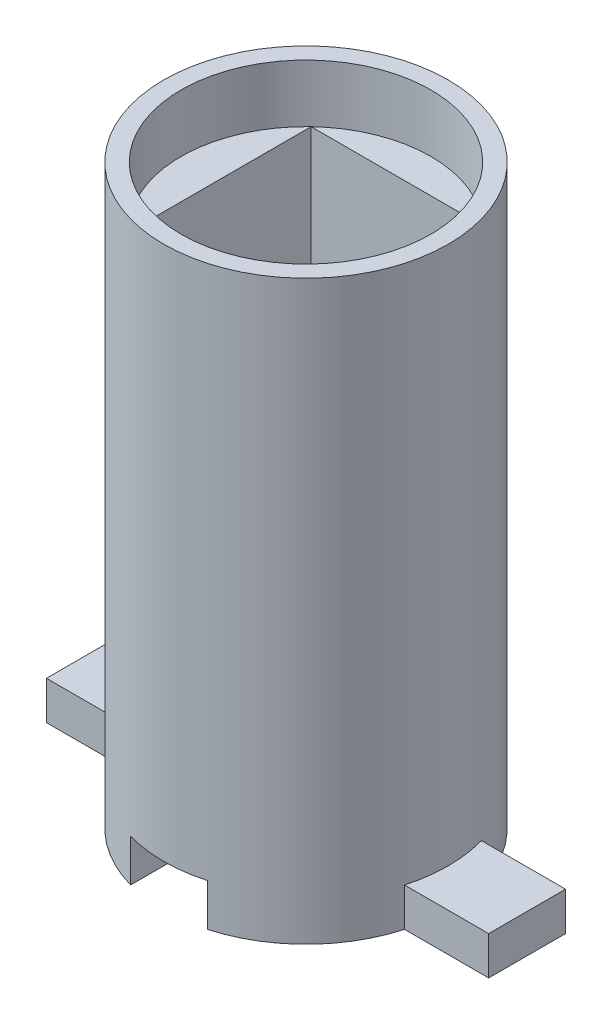
ISO-10303-21;
HEADER;
FILE_DESCRIPTION(('STEP AP214'),'2;1');
FILE_NAME('part.step','',(''),(''),'','','');
FILE_SCHEMA(('AUTOMOTIVE_DESIGN { 1 0 10303 214 1 1 1 1 }'));
ENDSEC;
DATA;
#1=APPLICATION_CONTEXT('core data for automotive mechanical design processes');
#2=APPLICATION_PROTOCOL_DEFINITION('international standard','automotive_design',2000,#1);
#3=PRODUCT_CONTEXT('',#1,'mechanical');
#4=PRODUCT('Part','Part','',(#3));
#5=PRODUCT_RELATED_PRODUCT_CATEGORY('part','',(#4));
#6=PRODUCT_DEFINITION_FORMATION('','',#4);
#7=PRODUCT_DEFINITION_CONTEXT('part definition',#1,'design');
#8=PRODUCT_DEFINITION('design','',#6,#7);
#9=PRODUCT_DEFINITION_SHAPE('','',#8);
#10=(LENGTH_UNIT() NAMED_UNIT(*) SI_UNIT(.MILLI.,.METRE.));
#11=(NAMED_UNIT(*) PLANE_ANGLE_UNIT() SI_UNIT($,.RADIAN.));
#12=(NAMED_UNIT(*) SI_UNIT($,.STERADIAN.) SOLID_ANGLE_UNIT());
#13=UNCERTAINTY_MEASURE_WITH_UNIT(LENGTH_MEASURE(1.E-05),#10,'distance_accuracy_value','');
#14=(GEOMETRIC_REPRESENTATION_CONTEXT(3) GLOBAL_UNCERTAINTY_ASSIGNED_CONTEXT((#13)) GLOBAL_UNIT_ASSIGNED_CONTEXT((#10,
#11,#12)) REPRESENTATION_CONTEXT('',''));
#15=CARTESIAN_POINT('',(0.,0.,0.));
#16=DIRECTION('',(0.,0.,1.));
#17=DIRECTION('',(1.,0.,0.));
#18=AXIS2_PLACEMENT_3D('',#15,#16,#17);
#19=CARTESIAN_POINT('',(21.5,36.,21.5));
#20=DIRECTION('',(1.,0.,0.));
#21=DIRECTION('',(0.,0.,-1.));
#22=AXIS2_PLACEMENT_3D('',#19,#20,#21);
#23=PLANE('',#22);
#24=DIRECTION('',(0.,0.,1.));
#25=VECTOR('',#24,1.);
#26=CARTESIAN_POINT('',(21.5,0.,21.5));
#27=LINE('',#26,#25);
#28=CARTESIAN_POINT('',(21.5,0.,-16.5));
#29=VERTEX_POINT('',#28);
#30=CARTESIAN_POINT('',(21.5,0.,16.5));
#31=VERTEX_POINT('',#30);
#32=EDGE_CURVE('E384',#29,#31,#27,.T.);
#33=ORIENTED_EDGE('',*,*,#32,.T.);
#34=DIRECTION('',(0.,1.,0.));
#35=VECTOR('',#34,1.);
#36=CARTESIAN_POINT('',(21.5,36.,16.5));
#37=LINE('',#36,#35);
#38=CARTESIAN_POINT('',(21.5,31.,16.5));
#39=VERTEX_POINT('',#38);
#40=EDGE_CURVE('E423',#31,#39,#37,.T.);
#41=ORIENTED_EDGE('',*,*,#40,.T.);
#42=DIRECTION('',(0.,0.,1.));
#43=VECTOR('',#42,1.);
#44=CARTESIAN_POINT('',(21.5,31.,21.5));
#45=LINE('',#44,#43);
#46=CARTESIAN_POINT('',(21.5,31.,-16.5));
#47=VERTEX_POINT('',#46);
#48=EDGE_CURVE('E361',#47,#39,#45,.T.);
#49=ORIENTED_EDGE('',*,*,#48,.F.);
#50=DIRECTION('',(0.,-1.,0.));
#51=VECTOR('',#50,1.);
#52=CARTESIAN_POINT('',(21.5,0.,-16.5));
#53=LINE('',#52,#51);
#54=EDGE_CURVE('E420',#47,#29,#53,.T.);
#55=ORIENTED_EDGE('',*,*,#54,.T.);
#56=EDGE_LOOP('',(#33,#41,#49,#55));
#57=FACE_BOUND('',#56,.T.);
#58=ADVANCED_FACE('F41',(#57),#23,.F.);
#59=CARTESIAN_POINT('',(-21.5,36.,-21.5));
#60=DIRECTION('',(0.,0.,-1.));
#61=DIRECTION('',(-1.,0.,0.));
#62=AXIS2_PLACEMENT_3D('',#59,#60,#61);
#63=PLANE('',#62);
#64=DIRECTION('',(1.,0.,0.));
#65=VECTOR('',#64,1.);
#66=CARTESIAN_POINT('',(-21.5,31.,-21.5));
#67=LINE('',#66,#65);
#68=CARTESIAN_POINT('',(-16.4999999999999,31.,-21.5));
#69=VERTEX_POINT('',#68);
#70=CARTESIAN_POINT('',(16.5,31.,-21.5));
#71=VERTEX_POINT('',#70);
#72=EDGE_CURVE('E349',#69,#71,#67,.T.);
#73=ORIENTED_EDGE('',*,*,#72,.F.);
#74=DIRECTION('',(0.,-1.,0.));
#75=VECTOR('',#74,1.);
#76=CARTESIAN_POINT('',(-16.4999999999999,0.,-21.5));
#77=LINE('',#76,#75);
#78=CARTESIAN_POINT('',(-16.4999999999999,0.,-21.5));
#79=VERTEX_POINT('',#78);
#80=EDGE_CURVE('E438',#69,#79,#77,.T.);
#81=ORIENTED_EDGE('',*,*,#80,.T.);
#82=DIRECTION('',(1.,0.,0.));
#83=VECTOR('',#82,1.);
#84=CARTESIAN_POINT('',(-21.5,0.,-21.5));
#85=LINE('',#84,#83);
#86=CARTESIAN_POINT('',(16.5,0.,-21.5));
#87=VERTEX_POINT('',#86);
#88=EDGE_CURVE('E400',#79,#87,#85,.T.);
#89=ORIENTED_EDGE('',*,*,#88,.T.);
#90=DIRECTION('',(0.,1.,0.));
#91=VECTOR('',#90,1.);
#92=CARTESIAN_POINT('',(16.5,36.,-21.5));
#93=LINE('',#92,#91);
#94=EDGE_CURVE('E434',#87,#71,#93,.T.);
#95=ORIENTED_EDGE('',*,*,#94,.T.);
#96=EDGE_LOOP('',(#73,#81,#89,#95));
#97=FACE_BOUND('',#96,.T.);
#98=ADVANCED_FACE('F504',(#97),#63,.F.);
#99=CARTESIAN_POINT('',(-21.5,36.,21.5));
#100=DIRECTION('',(-1.,0.,0.));
#101=DIRECTION('',(0.,0.,1.));
#102=AXIS2_PLACEMENT_3D('',#99,#100,#101);
#103=PLANE('',#102);
#104=DIRECTION('',(0.,0.,-1.));
#105=VECTOR('',#104,1.);
#106=CARTESIAN_POINT('',(-21.5,0.,21.5));
#107=LINE('',#106,#105);
#108=CARTESIAN_POINT('',(-21.5,0.,16.5));
#109=VERTEX_POINT('',#108);
#110=CARTESIAN_POINT('',(-21.5,0.,-16.5));
#111=VERTEX_POINT('',#110);
#112=EDGE_CURVE('E397',#109,#111,#107,.T.);
#113=ORIENTED_EDGE('',*,*,#112,.T.);
#114=DIRECTION('',(0.,1.,0.));
#115=VECTOR('',#114,1.);
#116=CARTESIAN_POINT('',(-21.5,36.,-16.5));
#117=LINE('',#116,#115);
#118=CARTESIAN_POINT('',(-21.5,31.,-16.5));
#119=VERTEX_POINT('',#118);
#120=EDGE_CURVE('E427',#111,#119,#117,.T.);
#121=ORIENTED_EDGE('',*,*,#120,.T.);
#122=DIRECTION('',(0.,0.,-1.));
#123=VECTOR('',#122,1.);
#124=CARTESIAN_POINT('',(-21.5,31.,21.5));
#125=LINE('',#124,#123);
#126=CARTESIAN_POINT('',(-21.5,31.,16.5));
#127=VERTEX_POINT('',#126);
#128=EDGE_CURVE('E373',#127,#119,#125,.T.);
#129=ORIENTED_EDGE('',*,*,#128,.F.);
#130=DIRECTION('',(0.,-1.,0.));
#131=VECTOR('',#130,1.);
#132=CARTESIAN_POINT('',(-21.5,0.,16.5));
#133=LINE('',#132,#131);
#134=EDGE_CURVE('E431',#127,#109,#133,.T.);
#135=ORIENTED_EDGE('',*,*,#134,.T.);
#136=EDGE_LOOP('',(#113,#121,#129,#135));
#137=FACE_BOUND('',#136,.T.);
#138=ADVANCED_FACE('F510',(#137),#103,.F.);
#139=CARTESIAN_POINT('',(-21.5,36.,21.5));
#140=DIRECTION('',(0.,0.,1.));
#141=DIRECTION('',(1.,0.,0.));
#142=AXIS2_PLACEMENT_3D('',#139,#140,#141);
#143=PLANE('',#142);
#144=DIRECTION('',(-1.,0.,0.));
#145=VECTOR('',#144,1.);
#146=CARTESIAN_POINT('',(-21.5,0.,21.5));
#147=LINE('',#146,#145);
#148=CARTESIAN_POINT('',(16.4999999999999,0.,21.5));
#149=VERTEX_POINT('',#148);
#150=CARTESIAN_POINT('',(10.,0.,21.5));
#151=VERTEX_POINT('',#150);
#152=EDGE_CURVE('E393',#149,#151,#147,.T.);
#153=ORIENTED_EDGE('',*,*,#152,.T.);
#154=DIRECTION('',(0.,-1.,0.));
#155=VECTOR('',#154,1.);
#156=CARTESIAN_POINT('',(10.,11.,21.5));
#157=LINE('',#156,#155);
#158=CARTESIAN_POINT('',(10.,11.,21.5));
#159=VERTEX_POINT('',#158);
#160=EDGE_CURVE('E268',#159,#151,#157,.T.);
#161=ORIENTED_EDGE('',*,*,#160,.F.);
#162=DIRECTION('',(1.,0.,0.));
#163=VECTOR('',#162,1.);
#164=CARTESIAN_POINT('',(-10.,11.,21.5));
#165=LINE('',#164,#163);
#166=CARTESIAN_POINT('',(-10.,11.,21.5));
#167=VERTEX_POINT('',#166);
#168=EDGE_CURVE('E261',#167,#159,#165,.T.);
#169=ORIENTED_EDGE('',*,*,#168,.F.);
#170=DIRECTION('',(0.,-1.,0.));
#171=VECTOR('',#170,1.);
#172=CARTESIAN_POINT('',(-10.,11.,21.5));
#173=LINE('',#172,#171);
#174=CARTESIAN_POINT('',(-10.,0.,21.5));
#175=VERTEX_POINT('',#174);
#176=EDGE_CURVE('E265',#167,#175,#173,.T.);
#177=ORIENTED_EDGE('',*,*,#176,.T.);
#178=CARTESIAN_POINT('',(-16.5,0.,21.5));
#179=VERTEX_POINT('',#178);
#180=EDGE_CURVE('E392',#175,#179,#147,.T.);
#181=ORIENTED_EDGE('',*,*,#180,.T.);
#182=DIRECTION('',(0.,1.,0.));
#183=VECTOR('',#182,1.);
#184=CARTESIAN_POINT('',(-16.5,36.,21.5));
#185=LINE('',#184,#183);
#186=CARTESIAN_POINT('',(-16.5,31.,21.5));
#187=VERTEX_POINT('',#186);
#188=EDGE_CURVE('E409',#179,#187,#185,.T.);
#189=ORIENTED_EDGE('',*,*,#188,.T.);
#190=DIRECTION('',(-1.,0.,0.));
#191=VECTOR('',#190,1.);
#192=CARTESIAN_POINT('',(-21.5,31.,21.5));
#193=LINE('',#192,#191);
#194=CARTESIAN_POINT('',(16.4999999999999,31.,21.5));
#195=VERTEX_POINT('',#194);
#196=EDGE_CURVE('E370',#195,#187,#193,.T.);
#197=ORIENTED_EDGE('',*,*,#196,.F.);
#198=DIRECTION('',(0.,-1.,0.));
#199=VECTOR('',#198,1.);
#200=CARTESIAN_POINT('',(16.4999999999999,0.,21.5));
#201=LINE('',#200,#199);
#202=EDGE_CURVE('E417',#195,#149,#201,.T.);
#203=ORIENTED_EDGE('',*,*,#202,.T.);
#204=EDGE_LOOP('',(#153,#161,#169,#177,#181,#189,#197,#203));
#205=FACE_BOUND('',#204,.T.);
#206=ADVANCED_FACE('F515',(#205),#143,.F.);
#207=CARTESIAN_POINT('',(16.4999999999999,36.,21.5));
#208=DIRECTION('',(-0.707106781186543,0.,-0.707106781186551));
#209=DIRECTION('',(0.,1.,0.));
#210=AXIS2_PLACEMENT_3D('',#207,#208,#209);
#211=PLANE('',#210);
#212=DIRECTION('',(0.707106781186551,0.,-0.707106781186544));
#213=VECTOR('',#212,1.);
#214=CARTESIAN_POINT('',(16.4999999999999,31.,21.5));
#215=LINE('',#214,#213);
#216=EDGE_CURVE('E367',#39,#195,#215,.F.);
#217=ORIENTED_EDGE('',*,*,#216,.F.);
#218=ORIENTED_EDGE('',*,*,#40,.F.);
#219=DIRECTION('',(-0.707106781186551,0.,0.707106781186544));
#220=VECTOR('',#219,1.);
#221=CARTESIAN_POINT('',(18.9999999999999,0.,19.0000000000001));
#222=LINE('',#221,#220);
#223=EDGE_CURVE('E441',#149,#31,#222,.F.);
#224=ORIENTED_EDGE('',*,*,#223,.F.);
#225=ORIENTED_EDGE('',*,*,#202,.F.);
#226=EDGE_LOOP('',(#217,#218,#224,#225));
#227=FACE_BOUND('',#226,.T.);
#228=ADVANCED_FACE('F529',(#227),#211,.T.);
#229=CARTESIAN_POINT('',(-21.5,36.,16.5));
#230=DIRECTION('',(0.707106781186551,0.,-0.707106781186544));
#231=DIRECTION('',(0.,1.,0.));
#232=AXIS2_PLACEMENT_3D('',#229,#230,#231);
#233=PLANE('',#232);
#234=DIRECTION('',(0.707106781186544,0.,0.707106781186551));
#235=VECTOR('',#234,1.);
#236=CARTESIAN_POINT('',(-21.5,31.,16.5));
#237=LINE('',#236,#235);
#238=EDGE_CURVE('E376',#187,#127,#237,.F.);
#239=ORIENTED_EDGE('',*,*,#238,.F.);
#240=ORIENTED_EDGE('',*,*,#188,.F.);
#241=DIRECTION('',(-0.707106781186544,0.,-0.707106781186551));
#242=VECTOR('',#241,1.);
#243=CARTESIAN_POINT('',(-19.0000000000001,0.,18.9999999999999));
#244=LINE('',#243,#242);
#245=EDGE_CURVE('E445',#109,#179,#244,.F.);
#246=ORIENTED_EDGE('',*,*,#245,.F.);
#247=ORIENTED_EDGE('',*,*,#134,.F.);
#248=EDGE_LOOP('',(#239,#240,#246,#247));
#249=FACE_BOUND('',#248,.T.);
#250=ADVANCED_FACE('F535',(#249),#233,.T.);
#251=CARTESIAN_POINT('',(-16.4999999999999,36.,-21.5));
#252=DIRECTION('',(0.707106781186543,0.,0.707106781186551));
#253=DIRECTION('',(0.,1.,0.));
#254=AXIS2_PLACEMENT_3D('',#251,#252,#253);
#255=PLANE('',#254);
#256=DIRECTION('',(-0.707106781186551,0.,0.707106781186544));
#257=VECTOR('',#256,1.);
#258=CARTESIAN_POINT('',(-16.4999999999999,31.,-21.5));
#259=LINE('',#258,#257);
#260=EDGE_CURVE('E364',#119,#69,#259,.F.);
#261=ORIENTED_EDGE('',*,*,#260,.F.);
#262=ORIENTED_EDGE('',*,*,#120,.F.);
#263=DIRECTION('',(0.707106781186551,0.,-0.707106781186544));
#264=VECTOR('',#263,1.);
#265=CARTESIAN_POINT('',(-18.9999999999999,0.,-19.0000000000001));
#266=LINE('',#265,#264);
#267=EDGE_CURVE('E449',#79,#111,#266,.F.);
#268=ORIENTED_EDGE('',*,*,#267,.F.);
#269=ORIENTED_EDGE('',*,*,#80,.F.);
#270=EDGE_LOOP('',(#261,#262,#268,#269));
#271=FACE_BOUND('',#270,.T.);
#272=ADVANCED_FACE('F541',(#271),#255,.T.);
#273=CARTESIAN_POINT('',(21.5,36.,-16.5));
#274=DIRECTION('',(-0.707106781186551,0.,0.707106781186544));
#275=DIRECTION('',(0.,1.,0.));
#276=AXIS2_PLACEMENT_3D('',#273,#274,#275);
#277=PLANE('',#276);
#278=DIRECTION('',(-0.707106781186544,0.,-0.707106781186551));
#279=VECTOR('',#278,1.);
#280=CARTESIAN_POINT('',(21.5,31.,-16.5));
#281=LINE('',#280,#279);
#282=EDGE_CURVE('E456',#71,#47,#281,.F.);
#283=ORIENTED_EDGE('',*,*,#282,.F.);
#284=ORIENTED_EDGE('',*,*,#94,.F.);
#285=DIRECTION('',(0.707106781186544,0.,0.707106781186551));
#286=VECTOR('',#285,1.);
#287=CARTESIAN_POINT('',(19.0000000000001,0.,-18.9999999999999));
#288=LINE('',#287,#286);
#289=EDGE_CURVE('E453',#29,#87,#288,.F.);
#290=ORIENTED_EDGE('',*,*,#289,.F.);
#291=ORIENTED_EDGE('',*,*,#54,.F.);
#292=EDGE_LOOP('',(#283,#284,#290,#291));
#293=FACE_BOUND('',#292,.T.);
#294=ADVANCED_FACE('F44',(#293),#277,.T.);
#295=CARTESIAN_POINT('',(0.,135.,0.));
#296=DIRECTION('',(0.,1.,0.));
#297=DIRECTION('',(0.,0.,1.));
#298=AXIS2_PLACEMENT_3D('',#295,#296,#297);
#299=PLANE('',#298);
#300=DIRECTION('',(0.,0.,-1.));
#301=VECTOR('',#300,1.);
#302=CARTESIAN_POINT('',(22.303644928014,135.,-23.6388963982051));
#303=LINE('',#302,#301);
#304=CARTESIAN_POINT('',(22.303644928014,135.,23.6388963982051));
#305=VERTEX_POINT('',#304);
#306=CARTESIAN_POINT('',(22.303644928014,135.,-23.6388963982051));
#307=VERTEX_POINT('',#306);
#308=EDGE_CURVE('E314',#305,#307,#303,.T.);
#309=ORIENTED_EDGE('',*,*,#308,.F.);
#310=CARTESIAN_POINT('',(0.,135.,0.));
#311=DIRECTION('',(0.,1.,0.));
#312=DIRECTION('',(0.,0.,1.));
#313=AXIS2_PLACEMENT_3D('',#310,#311,#312);
#314=CIRCLE('',#313,32.5);
#315=EDGE_CURVE('E380',#305,#307,#314,.T.);
#316=ORIENTED_EDGE('',*,*,#315,.T.);
#317=EDGE_LOOP('',(#309,#316));
#318=FACE_BOUND('',#317,.T.);
#319=ADVANCED_FACE('F550',(#318),#299,.T.);
#320=DIRECTION('',(1.,0.,0.));
#321=VECTOR('',#320,1.);
#322=CARTESIAN_POINT('',(-22.303644928014,135.,23.6388963982051));
#323=LINE('',#322,#321);
#324=CARTESIAN_POINT('',(-22.303644928014,135.,23.6388963982051));
#325=VERTEX_POINT('',#324);
#326=EDGE_CURVE('E320',#325,#305,#323,.T.);
#327=ORIENTED_EDGE('',*,*,#326,.F.);
#328=EDGE_CURVE('E386',#325,#305,#314,.T.);
#329=ORIENTED_EDGE('',*,*,#328,.T.);
#330=EDGE_LOOP('',(#327,#329));
#331=FACE_BOUND('',#330,.T.);
#332=ADVANCED_FACE('F593',(#331),#299,.T.);
#333=DIRECTION('',(0.,0.,1.));
#334=VECTOR('',#333,1.);
#335=CARTESIAN_POINT('',(-22.303644928014,135.,-23.6388963982051));
#336=LINE('',#335,#334);
#337=CARTESIAN_POINT('',(-22.303644928014,135.,-23.6388963982051));
#338=VERTEX_POINT('',#337);
#339=EDGE_CURVE('E339',#338,#325,#336,.T.);
#340=ORIENTED_EDGE('',*,*,#339,.F.);
#341=EDGE_CURVE('E585',#338,#325,#314,.T.);
#342=ORIENTED_EDGE('',*,*,#341,.T.);
#343=EDGE_LOOP('',(#340,#342));
#344=FACE_BOUND('',#343,.T.);
#345=ADVANCED_FACE('F526',(#344),#299,.T.);
#346=CARTESIAN_POINT('',(0.,150.,0.));
#347=DIRECTION('',(0.,-1.,0.));
#348=DIRECTION('',(0.,0.,-1.));
#349=AXIS2_PLACEMENT_3D('',#346,#347,#348);
#350=CYLINDRICAL_SURFACE('',#349,37.);
#351=CARTESIAN_POINT('',(0.,150.,0.));
#352=DIRECTION('',(0.,1.,0.));
#353=DIRECTION('',(0.,0.,1.));
#354=AXIS2_PLACEMENT_3D('',#351,#352,#353);
#355=CIRCLE('',#354,37.);
#356=CARTESIAN_POINT('',(0.,150.,37.));
#357=VERTEX_POINT('',#356);
#358=EDGE_CURVE('E405',#357,#357,#355,.T.);
#359=ORIENTED_EDGE('',*,*,#358,.F.);
#360=EDGE_LOOP('',(#359));
#361=FACE_BOUND('',#360,.T.);
#362=CARTESIAN_POINT('',(0.,11.,0.));
#363=DIRECTION('',(0.,-1.,0.));
#364=DIRECTION('',(0.,0.,-1.));
#365=AXIS2_PLACEMENT_3D('',#362,#363,#364);
#366=CIRCLE('',#365,37.);
#367=CARTESIAN_POINT('',(10.,11.,35.6230262611138));
#368=VERTEX_POINT('',#367);
#369=CARTESIAN_POINT('',(-10.,11.,35.6230262611138));
#370=VERTEX_POINT('',#369);
#371=EDGE_CURVE('E11',#368,#370,#366,.T.);
#372=ORIENTED_EDGE('',*,*,#371,.F.);
#373=DIRECTION('',(0.,-1.,0.));
#374=VECTOR('',#373,1.);
#375=CARTESIAN_POINT('',(10.,150.,35.6230262611138));
#376=LINE('',#375,#374);
#377=CARTESIAN_POINT('',(10.,0.,35.6230262611138));
#378=VERTEX_POINT('',#377);
#379=EDGE_CURVE('E213',#368,#378,#376,.T.);
#380=ORIENTED_EDGE('',*,*,#379,.T.);
#381=CARTESIAN_POINT('',(0.,0.,0.));
#382=DIRECTION('',(0.,1.,0.));
#383=DIRECTION('',(0.,0.,1.));
#384=AXIS2_PLACEMENT_3D('',#381,#382,#383);
#385=CIRCLE('',#384,37.);
#386=CARTESIAN_POINT('',(35.6230262611138,0.,10.));
#387=VERTEX_POINT('',#386);
#388=EDGE_CURVE('E404',#378,#387,#385,.T.);
#389=ORIENTED_EDGE('',*,*,#388,.T.);
#390=DIRECTION('',(0.,-1.,0.));
#391=VECTOR('',#390,1.);
#392=CARTESIAN_POINT('',(35.6230262611138,150.,10.));
#393=LINE('',#392,#391);
#394=CARTESIAN_POINT('',(35.6230262611138,10.,10.));
#395=VERTEX_POINT('',#394);
#396=EDGE_CURVE('E302',#387,#395,#393,.F.);
#397=ORIENTED_EDGE('',*,*,#396,.T.);
#398=CARTESIAN_POINT('',(0.,10.,0.));
#399=DIRECTION('',(0.,1.,0.));
#400=DIRECTION('',(0.,0.,1.));
#401=AXIS2_PLACEMENT_3D('',#398,#399,#400);
#402=CIRCLE('',#401,37.);
#403=CARTESIAN_POINT('',(35.6230262611138,10.,-10.));
#404=VERTEX_POINT('',#403);
#405=EDGE_CURVE('E459',#395,#404,#402,.T.);
#406=ORIENTED_EDGE('',*,*,#405,.T.);
#407=DIRECTION('',(0.,-1.,0.));
#408=VECTOR('',#407,1.);
#409=CARTESIAN_POINT('',(35.6230262611138,150.,-10.));
#410=LINE('',#409,#408);
#411=CARTESIAN_POINT('',(35.6230262611138,0.,-10.));
#412=VERTEX_POINT('',#411);
#413=EDGE_CURVE('E310',#404,#412,#410,.T.);
#414=ORIENTED_EDGE('',*,*,#413,.T.);
#415=CARTESIAN_POINT('',(-35.6230262611138,0.,-10.));
#416=VERTEX_POINT('',#415);
#417=EDGE_CURVE('E410',#412,#416,#385,.T.);
#418=ORIENTED_EDGE('',*,*,#417,.T.);
#419=DIRECTION('',(0.,-1.,0.));
#420=VECTOR('',#419,1.);
#421=CARTESIAN_POINT('',(-35.6230262611138,150.,-10.));
#422=LINE('',#421,#420);
#423=CARTESIAN_POINT('',(-35.6230262611138,10.,-10.));
#424=VERTEX_POINT('',#423);
#425=EDGE_CURVE('E66',#416,#424,#422,.F.);
#426=ORIENTED_EDGE('',*,*,#425,.T.);
#427=CARTESIAN_POINT('',(0.,10.,0.));
#428=DIRECTION('',(0.,-1.,0.));
#429=DIRECTION('',(0.,0.,-1.));
#430=AXIS2_PLACEMENT_3D('',#427,#428,#429);
#431=CIRCLE('',#430,37.);
#432=CARTESIAN_POINT('',(-35.6230262611138,10.,10.));
#433=VERTEX_POINT('',#432);
#434=EDGE_CURVE('E462',#433,#424,#431,.T.);
#435=ORIENTED_EDGE('',*,*,#434,.F.);
#436=DIRECTION('',(0.,-1.,0.));
#437=VECTOR('',#436,1.);
#438=CARTESIAN_POINT('',(-35.6230262611138,150.,10.));
#439=LINE('',#438,#437);
#440=CARTESIAN_POINT('',(-35.6230262611138,0.,10.));
#441=VERTEX_POINT('',#440);
#442=EDGE_CURVE('E289',#433,#441,#439,.T.);
#443=ORIENTED_EDGE('',*,*,#442,.T.);
#444=CARTESIAN_POINT('',(-10.,0.,35.6230262611138));
#445=VERTEX_POINT('',#444);
#446=EDGE_CURVE('E413',#441,#445,#385,.T.);
#447=ORIENTED_EDGE('',*,*,#446,.T.);
#448=DIRECTION('',(0.,-1.,0.));
#449=VECTOR('',#448,1.);
#450=CARTESIAN_POINT('',(-10.,150.,35.6230262611138));
#451=LINE('',#450,#449);
#452=EDGE_CURVE('E58',#445,#370,#451,.F.);
#453=ORIENTED_EDGE('',*,*,#452,.T.);
#454=EDGE_LOOP('',(#372,#380,#389,#397,#406,#414,#418,#426,#435,#443,#447,#453));
#455=FACE_BOUND('',#454,.T.);
#456=ADVANCED_FACE('F469',(#361,#455),#350,.T.);
#457=CARTESIAN_POINT('',(0.,150.,0.));
#458=DIRECTION('',(0.,1.,0.));
#459=DIRECTION('',(0.,0.,1.));
#460=AXIS2_PLACEMENT_3D('',#457,#458,#459);
#461=PLANE('',#460);
#462=CARTESIAN_POINT('',(0.,150.,0.));
#463=DIRECTION('',(0.,1.,0.));
#464=DIRECTION('',(0.,0.,1.));
#465=AXIS2_PLACEMENT_3D('',#462,#463,#464);
#466=CIRCLE('',#465,32.5);
#467=CARTESIAN_POINT('',(0.,150.,32.5));
#468=VERTEX_POINT('',#467);
#469=EDGE_CURVE('E379',#468,#468,#466,.T.);
#470=ORIENTED_EDGE('',*,*,#469,.F.);
#471=EDGE_LOOP('',(#470));
#472=FACE_BOUND('',#471,.T.);
#473=ORIENTED_EDGE('',*,*,#358,.T.);
#474=EDGE_LOOP('',(#473));
#475=FACE_BOUND('',#474,.T.);
#476=ADVANCED_FACE('F517',(#472,#475),#461,.T.);
#477=CARTESIAN_POINT('',(0.,0.,0.));
#478=DIRECTION('',(0.,1.,0.));
#479=DIRECTION('',(0.,0.,1.));
#480=AXIS2_PLACEMENT_3D('',#477,#478,#479);
#481=PLANE('',#480);
#482=ORIENTED_EDGE('',*,*,#388,.F.);
#483=DIRECTION('',(0.,0.,1.));
#484=VECTOR('',#483,1.);
#485=CARTESIAN_POINT('',(10.,0.,52.5));
#486=LINE('',#485,#484);
#487=EDGE_CURVE('E253',#151,#378,#486,.T.);
#488=ORIENTED_EDGE('',*,*,#487,.F.);
#489=ORIENTED_EDGE('',*,*,#152,.F.);
#490=ORIENTED_EDGE('',*,*,#223,.T.);
#491=ORIENTED_EDGE('',*,*,#32,.F.);
#492=ORIENTED_EDGE('',*,*,#289,.T.);
#493=ORIENTED_EDGE('',*,*,#88,.F.);
#494=ORIENTED_EDGE('',*,*,#267,.T.);
#495=ORIENTED_EDGE('',*,*,#112,.F.);
#496=ORIENTED_EDGE('',*,*,#245,.T.);
#497=ORIENTED_EDGE('',*,*,#180,.F.);
#498=DIRECTION('',(0.,0.,1.));
#499=VECTOR('',#498,1.);
#500=CARTESIAN_POINT('',(-10.,0.,0.));
#501=LINE('',#500,#499);
#502=EDGE_CURVE('E51',#175,#445,#501,.T.);
#503=ORIENTED_EDGE('',*,*,#502,.T.);
#504=ORIENTED_EDGE('',*,*,#446,.F.);
#505=DIRECTION('',(-1.,0.,0.));
#506=VECTOR('',#505,1.);
#507=CARTESIAN_POINT('',(-47.5,0.,10.));
#508=LINE('',#507,#506);
#509=CARTESIAN_POINT('',(-57.5,0.,10.));
#510=VERTEX_POINT('',#509);
#511=EDGE_CURVE('E212',#441,#510,#508,.T.);
#512=ORIENTED_EDGE('',*,*,#511,.T.);
#513=DIRECTION('',(0.,0.,1.));
#514=VECTOR('',#513,1.);
#515=CARTESIAN_POINT('',(-57.5,0.,-10.));
#516=LINE('',#515,#514);
#517=CARTESIAN_POINT('',(-57.5,0.,-10.));
#518=VERTEX_POINT('',#517);
#519=EDGE_CURVE('E216',#518,#510,#516,.T.);
#520=ORIENTED_EDGE('',*,*,#519,.F.);
#521=DIRECTION('',(1.,0.,0.));
#522=VECTOR('',#521,1.);
#523=CARTESIAN_POINT('',(-47.5,0.,-10.));
#524=LINE('',#523,#522);
#525=EDGE_CURVE('E204',#518,#416,#524,.T.);
#526=ORIENTED_EDGE('',*,*,#525,.T.);
#527=ORIENTED_EDGE('',*,*,#417,.F.);
#528=DIRECTION('',(1.,0.,0.));
#529=VECTOR('',#528,1.);
#530=CARTESIAN_POINT('',(21.5,0.,-10.));
#531=LINE('',#530,#529);
#532=CARTESIAN_POINT('',(57.5,0.,-10.));
#533=VERTEX_POINT('',#532);
#534=EDGE_CURVE('E293',#412,#533,#531,.T.);
#535=ORIENTED_EDGE('',*,*,#534,.T.);
#536=DIRECTION('',(0.,0.,-1.));
#537=VECTOR('',#536,1.);
#538=CARTESIAN_POINT('',(57.5,0.,10.));
#539=LINE('',#538,#537);
#540=CARTESIAN_POINT('',(57.5,0.,10.));
#541=VERTEX_POINT('',#540);
#542=EDGE_CURVE('E241',#541,#533,#539,.T.);
#543=ORIENTED_EDGE('',*,*,#542,.F.);
#544=DIRECTION('',(-1.,0.,0.));
#545=VECTOR('',#544,1.);
#546=CARTESIAN_POINT('',(21.5,0.,10.));
#547=LINE('',#546,#545);
#548=EDGE_CURVE('E298',#541,#387,#547,.T.);
#549=ORIENTED_EDGE('',*,*,#548,.T.);
#550=EDGE_LOOP('',(#482,#488,#489,#490,#491,#492,#493,#494,#495,#496,#497,#503,#504,#512,#520,
#526,#527,#535,#543,#549));
#551=FACE_BOUND('',#550,.T.);
#552=ADVANCED_FACE('F218',(#551),#481,.F.);
#553=DIRECTION('',(-1.,0.,0.));
#554=VECTOR('',#553,1.);
#555=CARTESIAN_POINT('',(-22.303644928014,135.,-23.6388963982051));
#556=LINE('',#555,#554);
#557=EDGE_CURVE('E335',#307,#338,#556,.T.);
#558=ORIENTED_EDGE('',*,*,#557,.F.);
#559=EDGE_CURVE('E385',#307,#338,#314,.T.);
#560=ORIENTED_EDGE('',*,*,#559,.T.);
#561=EDGE_LOOP('',(#558,#560));
#562=FACE_BOUND('',#561,.T.);
#563=ADVANCED_FACE('F523',(#562),#299,.T.);
#564=CARTESIAN_POINT('',(0.,135.,0.));
#565=DIRECTION('',(0.,1.,0.));
#566=DIRECTION('',(0.,0.,1.));
#567=AXIS2_PLACEMENT_3D('',#564,#565,#566);
#568=CYLINDRICAL_SURFACE('',#567,32.5);
#569=ORIENTED_EDGE('',*,*,#315,.F.);
#570=ORIENTED_EDGE('',*,*,#328,.F.);
#571=ORIENTED_EDGE('',*,*,#341,.F.);
#572=ORIENTED_EDGE('',*,*,#559,.F.);
#573=EDGE_LOOP('',(#569,#570,#571,#572));
#574=FACE_BOUND('',#573,.T.);
#575=ORIENTED_EDGE('',*,*,#469,.T.);
#576=EDGE_LOOP('',(#575));
#577=FACE_BOUND('',#576,.T.);
#578=ADVANCED_FACE('F597',(#574,#577),#568,.F.);
#579=CARTESIAN_POINT('',(0.,31.,0.));
#580=DIRECTION('',(0.,1.,0.));
#581=DIRECTION('',(0.,0.,1.));
#582=AXIS2_PLACEMENT_3D('',#579,#580,#581);
#583=PLANE('',#582);
#584=DIRECTION('',(0.,0.,-1.));
#585=VECTOR('',#584,1.);
#586=CARTESIAN_POINT('',(22.303644928014,31.,-23.6388963982051));
#587=LINE('',#586,#585);
#588=CARTESIAN_POINT('',(22.303644928014,31.,23.6388963982051));
#589=VERTEX_POINT('',#588);
#590=CARTESIAN_POINT('',(22.303644928014,31.,-23.6388963982051));
#591=VERTEX_POINT('',#590);
#592=EDGE_CURVE('E315',#589,#591,#587,.T.);
#593=ORIENTED_EDGE('',*,*,#592,.T.);
#594=DIRECTION('',(-1.,0.,0.));
#595=VECTOR('',#594,1.);
#596=CARTESIAN_POINT('',(-22.303644928014,31.,-23.6388963982051));
#597=LINE('',#596,#595);
#598=CARTESIAN_POINT('',(-22.303644928014,31.,-23.6388963982051));
#599=VERTEX_POINT('',#598);
#600=EDGE_CURVE('E319',#591,#599,#597,.T.);
#601=ORIENTED_EDGE('',*,*,#600,.T.);
#602=DIRECTION('',(0.,0.,1.));
#603=VECTOR('',#602,1.);
#604=CARTESIAN_POINT('',(-22.303644928014,31.,-23.6388963982051));
#605=LINE('',#604,#603);
#606=CARTESIAN_POINT('',(-22.303644928014,31.,23.6388963982051));
#607=VERTEX_POINT('',#606);
#608=EDGE_CURVE('E324',#599,#607,#605,.T.);
#609=ORIENTED_EDGE('',*,*,#608,.T.);
#610=DIRECTION('',(1.,0.,0.));
#611=VECTOR('',#610,1.);
#612=CARTESIAN_POINT('',(-22.303644928014,31.,23.6388963982051));
#613=LINE('',#612,#611);
#614=EDGE_CURVE('E328',#607,#589,#613,.T.);
#615=ORIENTED_EDGE('',*,*,#614,.T.);
#616=EDGE_LOOP('',(#593,#601,#609,#615));
#617=FACE_BOUND('',#616,.T.);
#618=ORIENTED_EDGE('',*,*,#238,.T.);
#619=ORIENTED_EDGE('',*,*,#128,.T.);
#620=ORIENTED_EDGE('',*,*,#260,.T.);
#621=ORIENTED_EDGE('',*,*,#72,.T.);
#622=ORIENTED_EDGE('',*,*,#282,.T.);
#623=ORIENTED_EDGE('',*,*,#48,.T.);
#624=ORIENTED_EDGE('',*,*,#216,.T.);
#625=ORIENTED_EDGE('',*,*,#196,.T.);
#626=EDGE_LOOP('',(#618,#619,#620,#621,#622,#623,#624,#625));
#627=FACE_BOUND('',#626,.T.);
#628=ADVANCED_FACE('F570',(#617,#627),#583,.T.);
#629=CARTESIAN_POINT('',(22.303644928014,31.,-23.6388963982051));
#630=DIRECTION('',(1.,0.,0.));
#631=DIRECTION('',(0.,0.,-1.));
#632=AXIS2_PLACEMENT_3D('',#629,#630,#631);
#633=PLANE('',#632);
#634=ORIENTED_EDGE('',*,*,#308,.T.);
#635=DIRECTION('',(0.,1.,0.));
#636=VECTOR('',#635,1.);
#637=CARTESIAN_POINT('',(22.303644928014,31.,-23.6388963982051));
#638=LINE('',#637,#636);
#639=EDGE_CURVE('E332',#591,#307,#638,.T.);
#640=ORIENTED_EDGE('',*,*,#639,.F.);
#641=ORIENTED_EDGE('',*,*,#592,.F.);
#642=DIRECTION('',(0.,1.,0.));
#643=VECTOR('',#642,1.);
#644=CARTESIAN_POINT('',(22.303644928014,31.,23.6388963982051));
#645=LINE('',#644,#643);
#646=EDGE_CURVE('E346',#589,#305,#645,.T.);
#647=ORIENTED_EDGE('',*,*,#646,.T.);
#648=EDGE_LOOP('',(#634,#640,#641,#647));
#649=FACE_BOUND('',#648,.T.);
#650=ADVANCED_FACE('F602',(#649),#633,.F.);
#651=CARTESIAN_POINT('',(-22.303644928014,31.,23.6388963982051));
#652=DIRECTION('',(0.,0.,1.));
#653=DIRECTION('',(1.,0.,0.));
#654=AXIS2_PLACEMENT_3D('',#651,#652,#653);
#655=PLANE('',#654);
#656=ORIENTED_EDGE('',*,*,#326,.T.);
#657=ORIENTED_EDGE('',*,*,#646,.F.);
#658=ORIENTED_EDGE('',*,*,#614,.F.);
#659=DIRECTION('',(0.,1.,0.));
#660=VECTOR('',#659,1.);
#661=CARTESIAN_POINT('',(-22.303644928014,31.,23.6388963982051));
#662=LINE('',#661,#660);
#663=EDGE_CURVE('E350',#607,#325,#662,.T.);
#664=ORIENTED_EDGE('',*,*,#663,.T.);
#665=EDGE_LOOP('',(#656,#657,#658,#664));
#666=FACE_BOUND('',#665,.T.);
#667=ADVANCED_FACE('F626',(#666),#655,.F.);
#668=CARTESIAN_POINT('',(-22.303644928014,31.,-23.6388963982051));
#669=DIRECTION('',(-1.,0.,0.));
#670=DIRECTION('',(0.,0.,1.));
#671=AXIS2_PLACEMENT_3D('',#668,#669,#670);
#672=PLANE('',#671);
#673=ORIENTED_EDGE('',*,*,#339,.T.);
#674=ORIENTED_EDGE('',*,*,#663,.F.);
#675=ORIENTED_EDGE('',*,*,#608,.F.);
#676=DIRECTION('',(0.,1.,0.));
#677=VECTOR('',#676,1.);
#678=CARTESIAN_POINT('',(-22.303644928014,31.,-23.6388963982051));
#679=LINE('',#678,#677);
#680=EDGE_CURVE('E353',#599,#338,#679,.T.);
#681=ORIENTED_EDGE('',*,*,#680,.T.);
#682=EDGE_LOOP('',(#673,#674,#675,#681));
#683=FACE_BOUND('',#682,.T.);
#684=ADVANCED_FACE('F499',(#683),#672,.F.);
#685=CARTESIAN_POINT('',(-22.303644928014,31.,-23.6388963982051));
#686=DIRECTION('',(0.,0.,-1.));
#687=DIRECTION('',(-1.,0.,0.));
#688=AXIS2_PLACEMENT_3D('',#685,#686,#687);
#689=PLANE('',#688);
#690=ORIENTED_EDGE('',*,*,#557,.T.);
#691=ORIENTED_EDGE('',*,*,#680,.F.);
#692=ORIENTED_EDGE('',*,*,#600,.F.);
#693=ORIENTED_EDGE('',*,*,#639,.T.);
#694=EDGE_LOOP('',(#690,#691,#692,#693));
#695=FACE_BOUND('',#694,.T.);
#696=ADVANCED_FACE('F492',(#695),#689,.F.);
#697=CARTESIAN_POINT('',(21.5,10.,-10.));
#698=DIRECTION('',(0.,0.,-1.));
#699=DIRECTION('',(-1.,0.,0.));
#700=AXIS2_PLACEMENT_3D('',#697,#698,#699);
#701=PLANE('',#700);
#702=ORIENTED_EDGE('',*,*,#413,.F.);
#703=DIRECTION('',(1.,0.,0.));
#704=VECTOR('',#703,1.);
#705=CARTESIAN_POINT('',(21.5,10.,-10.));
#706=LINE('',#705,#704);
#707=CARTESIAN_POINT('',(57.5,10.,-10.));
#708=VERTEX_POINT('',#707);
#709=EDGE_CURVE('E294',#404,#708,#706,.T.);
#710=ORIENTED_EDGE('',*,*,#709,.T.);
#711=DIRECTION('',(0.,1.,0.));
#712=VECTOR('',#711,1.);
#713=CARTESIAN_POINT('',(57.5,10.,-10.));
#714=LINE('',#713,#712);
#715=EDGE_CURVE('E245',#533,#708,#714,.T.);
#716=ORIENTED_EDGE('',*,*,#715,.F.);
#717=ORIENTED_EDGE('',*,*,#534,.F.);
#718=EDGE_LOOP('',(#702,#710,#716,#717));
#719=FACE_BOUND('',#718,.T.);
#720=ADVANCED_FACE('F490',(#719),#701,.T.);
#721=CARTESIAN_POINT('',(21.5,10.,10.));
#722=DIRECTION('',(0.,0.,1.));
#723=DIRECTION('',(1.,0.,0.));
#724=AXIS2_PLACEMENT_3D('',#721,#722,#723);
#725=PLANE('',#724);
#726=ORIENTED_EDGE('',*,*,#396,.F.);
#727=ORIENTED_EDGE('',*,*,#548,.F.);
#728=DIRECTION('',(0.,-1.,0.));
#729=VECTOR('',#728,1.);
#730=CARTESIAN_POINT('',(57.5,10.,10.));
#731=LINE('',#730,#729);
#732=CARTESIAN_POINT('',(57.5,10.,10.));
#733=VERTEX_POINT('',#732);
#734=EDGE_CURVE('E237',#733,#541,#731,.T.);
#735=ORIENTED_EDGE('',*,*,#734,.F.);
#736=DIRECTION('',(-1.,0.,0.));
#737=VECTOR('',#736,1.);
#738=CARTESIAN_POINT('',(21.5,10.,10.));
#739=LINE('',#738,#737);
#740=EDGE_CURVE('E297',#733,#395,#739,.T.);
#741=ORIENTED_EDGE('',*,*,#740,.T.);
#742=EDGE_LOOP('',(#726,#727,#735,#741));
#743=FACE_BOUND('',#742,.T.);
#744=ADVANCED_FACE('F477',(#743),#725,.T.);
#745=CARTESIAN_POINT('',(0.,10.,0.));
#746=DIRECTION('',(0.,1.,0.));
#747=DIRECTION('',(0.,0.,1.));
#748=AXIS2_PLACEMENT_3D('',#745,#746,#747);
#749=PLANE('',#748);
#750=ORIENTED_EDGE('',*,*,#405,.F.);
#751=ORIENTED_EDGE('',*,*,#740,.F.);
#752=DIRECTION('',(0.,0.,1.));
#753=VECTOR('',#752,1.);
#754=CARTESIAN_POINT('',(57.5,10.,10.));
#755=LINE('',#754,#753);
#756=EDGE_CURVE('E249',#708,#733,#755,.T.);
#757=ORIENTED_EDGE('',*,*,#756,.F.);
#758=ORIENTED_EDGE('',*,*,#709,.F.);
#759=EDGE_LOOP('',(#750,#751,#757,#758));
#760=FACE_BOUND('',#759,.T.);
#761=ADVANCED_FACE('F487',(#760),#749,.T.);
#762=CARTESIAN_POINT('',(-47.5,10.,10.));
#763=DIRECTION('',(0.,0.,1.));
#764=DIRECTION('',(1.,0.,0.));
#765=AXIS2_PLACEMENT_3D('',#762,#763,#764);
#766=PLANE('',#765);
#767=ORIENTED_EDGE('',*,*,#442,.F.);
#768=DIRECTION('',(-1.,0.,0.));
#769=VECTOR('',#768,1.);
#770=CARTESIAN_POINT('',(-47.5,10.,10.));
#771=LINE('',#770,#769);
#772=CARTESIAN_POINT('',(-57.5,10.,10.));
#773=VERTEX_POINT('',#772);
#774=EDGE_CURVE('E282',#433,#773,#771,.T.);
#775=ORIENTED_EDGE('',*,*,#774,.T.);
#776=DIRECTION('',(0.,1.,0.));
#777=VECTOR('',#776,1.);
#778=CARTESIAN_POINT('',(-57.5,10.,10.));
#779=LINE('',#778,#777);
#780=EDGE_CURVE('E224',#510,#773,#779,.T.);
#781=ORIENTED_EDGE('',*,*,#780,.F.);
#782=ORIENTED_EDGE('',*,*,#511,.F.);
#783=EDGE_LOOP('',(#767,#775,#781,#782));
#784=FACE_BOUND('',#783,.T.);
#785=ADVANCED_FACE('F742',(#784),#766,.T.);
#786=CARTESIAN_POINT('',(-47.5,10.,-10.));
#787=DIRECTION('',(0.,0.,-1.));
#788=DIRECTION('',(-1.,0.,0.));
#789=AXIS2_PLACEMENT_3D('',#786,#787,#788);
#790=PLANE('',#789);
#791=ORIENTED_EDGE('',*,*,#425,.F.);
#792=ORIENTED_EDGE('',*,*,#525,.F.);
#793=DIRECTION('',(0.,-1.,0.));
#794=VECTOR('',#793,1.);
#795=CARTESIAN_POINT('',(-57.5,10.,-10.));
#796=LINE('',#795,#794);
#797=CARTESIAN_POINT('',(-57.5,10.,-10.));
#798=VERTEX_POINT('',#797);
#799=EDGE_CURVE('E209',#798,#518,#796,.T.);
#800=ORIENTED_EDGE('',*,*,#799,.F.);
#801=DIRECTION('',(1.,0.,0.));
#802=VECTOR('',#801,1.);
#803=CARTESIAN_POINT('',(-47.5,10.,-10.));
#804=LINE('',#803,#802);
#805=EDGE_CURVE('E279',#798,#424,#804,.T.);
#806=ORIENTED_EDGE('',*,*,#805,.T.);
#807=EDGE_LOOP('',(#791,#792,#800,#806));
#808=FACE_BOUND('',#807,.T.);
#809=ADVANCED_FACE('F206',(#808),#790,.T.);
#810=CARTESIAN_POINT('',(0.,10.,0.));
#811=DIRECTION('',(0.,-1.,0.));
#812=DIRECTION('',(0.,0.,-1.));
#813=AXIS2_PLACEMENT_3D('',#810,#811,#812);
#814=PLANE('',#813);
#815=ORIENTED_EDGE('',*,*,#774,.F.);
#816=ORIENTED_EDGE('',*,*,#434,.T.);
#817=ORIENTED_EDGE('',*,*,#805,.F.);
#818=DIRECTION('',(0.,0.,-1.));
#819=VECTOR('',#818,1.);
#820=CARTESIAN_POINT('',(-57.5,10.,-10.));
#821=LINE('',#820,#819);
#822=EDGE_CURVE('E229',#773,#798,#821,.T.);
#823=ORIENTED_EDGE('',*,*,#822,.F.);
#824=EDGE_LOOP('',(#815,#816,#817,#823));
#825=FACE_BOUND('',#824,.T.);
#826=ADVANCED_FACE('F698',(#825),#814,.F.);
#827=CARTESIAN_POINT('',(0.,11.,0.));
#828=DIRECTION('',(0.,-1.,0.));
#829=DIRECTION('',(0.,0.,-1.));
#830=AXIS2_PLACEMENT_3D('',#827,#828,#829);
#831=PLANE('',#830);
#832=ORIENTED_EDGE('',*,*,#371,.T.);
#833=DIRECTION('',(0.,0.,-1.));
#834=VECTOR('',#833,1.);
#835=CARTESIAN_POINT('',(-10.,11.,52.5));
#836=LINE('',#835,#834);
#837=EDGE_CURVE('E258',#370,#167,#836,.T.);
#838=ORIENTED_EDGE('',*,*,#837,.T.);
#839=ORIENTED_EDGE('',*,*,#168,.T.);
#840=DIRECTION('',(0.,0.,1.));
#841=VECTOR('',#840,1.);
#842=CARTESIAN_POINT('',(10.,11.,52.5));
#843=LINE('',#842,#841);
#844=EDGE_CURVE('E254',#159,#368,#843,.T.);
#845=ORIENTED_EDGE('',*,*,#844,.T.);
#846=EDGE_LOOP('',(#832,#838,#839,#845));
#847=FACE_BOUND('',#846,.T.);
#848=ADVANCED_FACE('F692',(#847),#831,.T.);
#849=CARTESIAN_POINT('',(10.,11.,52.5));
#850=DIRECTION('',(1.,0.,0.));
#851=DIRECTION('',(0.,0.,-1.));
#852=AXIS2_PLACEMENT_3D('',#849,#850,#851);
#853=PLANE('',#852);
#854=ORIENTED_EDGE('',*,*,#844,.F.);
#855=ORIENTED_EDGE('',*,*,#160,.T.);
#856=ORIENTED_EDGE('',*,*,#487,.T.);
#857=ORIENTED_EDGE('',*,*,#379,.F.);
#858=EDGE_LOOP('',(#854,#855,#856,#857));
#859=FACE_BOUND('',#858,.T.);
#860=ADVANCED_FACE('F697',(#859),#853,.F.);
#861=CARTESIAN_POINT('',(-10.,11.,52.5));
#862=DIRECTION('',(-1.,0.,0.));
#863=DIRECTION('',(0.,0.,1.));
#864=AXIS2_PLACEMENT_3D('',#861,#862,#863);
#865=PLANE('',#864);
#866=ORIENTED_EDGE('',*,*,#502,.F.);
#867=ORIENTED_EDGE('',*,*,#176,.F.);
#868=ORIENTED_EDGE('',*,*,#837,.F.);
#869=ORIENTED_EDGE('',*,*,#452,.F.);
#870=EDGE_LOOP('',(#866,#867,#868,#869));
#871=FACE_BOUND('',#870,.T.);
#872=ADVANCED_FACE('F710',(#871),#865,.F.);
#873=CARTESIAN_POINT('',(57.5,0.,0.));
#874=DIRECTION('',(1.,0.,0.));
#875=DIRECTION('',(0.,0.,-1.));
#876=AXIS2_PLACEMENT_3D('',#873,#874,#875);
#877=PLANE('',#876);
#878=ORIENTED_EDGE('',*,*,#734,.T.);
#879=ORIENTED_EDGE('',*,*,#542,.T.);
#880=ORIENTED_EDGE('',*,*,#715,.T.);
#881=ORIENTED_EDGE('',*,*,#756,.T.);
#882=EDGE_LOOP('',(#878,#879,#880,#881));
#883=FACE_BOUND('',#882,.T.);
#884=ADVANCED_FACE('F483',(#883),#877,.T.);
#885=CARTESIAN_POINT('',(-57.5,0.,0.));
#886=DIRECTION('',(-1.,0.,0.));
#887=DIRECTION('',(0.,0.,1.));
#888=AXIS2_PLACEMENT_3D('',#885,#886,#887);
#889=PLANE('',#888);
#890=ORIENTED_EDGE('',*,*,#799,.T.);
#891=ORIENTED_EDGE('',*,*,#519,.T.);
#892=ORIENTED_EDGE('',*,*,#780,.T.);
#893=ORIENTED_EDGE('',*,*,#822,.T.);
#894=EDGE_LOOP('',(#890,#891,#892,#893));
#895=FACE_BOUND('',#894,.T.);
#896=ADVANCED_FACE('F227',(#895),#889,.T.);
#897=CLOSED_SHELL('',(#58,#98,#138,#206,#228,#250,#272,#294,#319,#332,#345,#456,#476,#552,#563,
#578,#628,#650,#667,#684,#696,#720,#744,#761,#785,#809,#826,#848,#860,#872,#884,#896));
#898=MANIFOLD_SOLID_BREP('B2',#897);
#899=ADVANCED_BREP_SHAPE_REPRESENTATION('',(#18,#898),#14);
#900=SHAPE_DEFINITION_REPRESENTATION(#9,#899);
ENDSEC;
END-ISO-10303-21;
